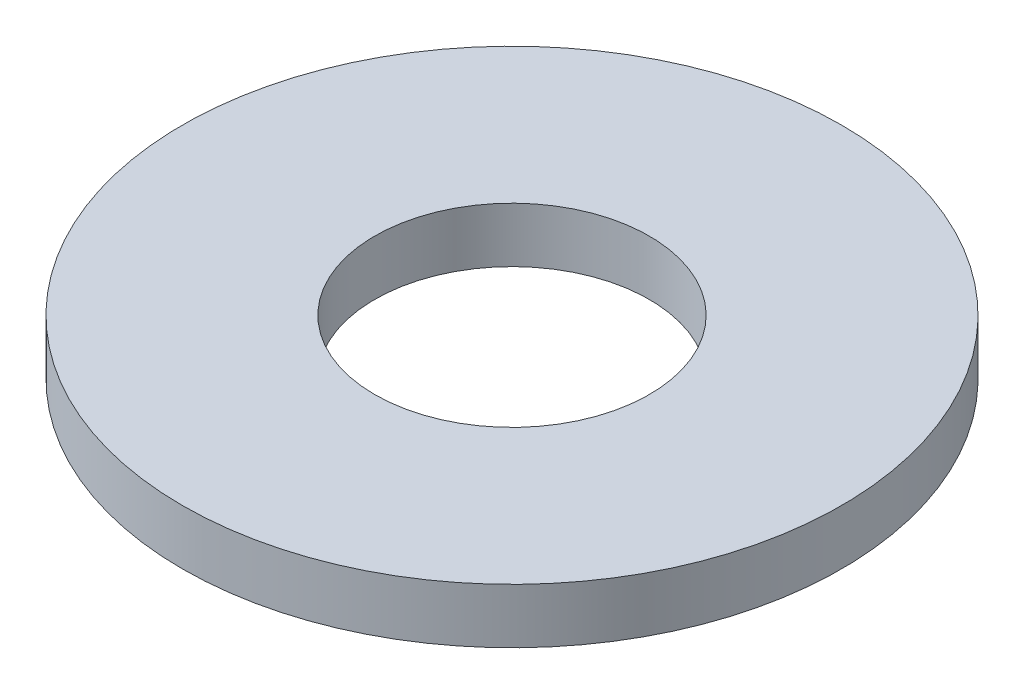
ISO-10303-21;
HEADER;
FILE_DESCRIPTION(('STEP AP214'),'2;1');
FILE_NAME('part.step','',(''),(''),'','','');
FILE_SCHEMA(('AUTOMOTIVE_DESIGN { 1 0 10303 214 1 1 1 1 }'));
ENDSEC;
DATA;
#1=APPLICATION_CONTEXT('core data for automotive mechanical design processes');
#2=APPLICATION_PROTOCOL_DEFINITION('international standard','automotive_design',2000,#1);
#3=PRODUCT_CONTEXT('',#1,'mechanical');
#4=PRODUCT('Part','Part','',(#3));
#5=PRODUCT_RELATED_PRODUCT_CATEGORY('part','',(#4));
#6=PRODUCT_DEFINITION_FORMATION('','',#4);
#7=PRODUCT_DEFINITION_CONTEXT('part definition',#1,'design');
#8=PRODUCT_DEFINITION('design','',#6,#7);
#9=PRODUCT_DEFINITION_SHAPE('','',#8);
#10=(LENGTH_UNIT() NAMED_UNIT(*) SI_UNIT(.MILLI.,.METRE.));
#11=(NAMED_UNIT(*) PLANE_ANGLE_UNIT() SI_UNIT($,.RADIAN.));
#12=(NAMED_UNIT(*) SI_UNIT($,.STERADIAN.) SOLID_ANGLE_UNIT());
#13=UNCERTAINTY_MEASURE_WITH_UNIT(LENGTH_MEASURE(1.E-05),#10,'distance_accuracy_value','');
#14=(GEOMETRIC_REPRESENTATION_CONTEXT(3) GLOBAL_UNCERTAINTY_ASSIGNED_CONTEXT((#13)) GLOBAL_UNIT_ASSIGNED_CONTEXT((#10,
#11,#12)) REPRESENTATION_CONTEXT('',''));
#15=CARTESIAN_POINT('',(0.,0.,0.));
#16=DIRECTION('',(0.,0.,1.));
#17=DIRECTION('',(1.,0.,0.));
#18=AXIS2_PLACEMENT_3D('',#15,#16,#17);
#19=CARTESIAN_POINT('',(0.,1.27,0.));
#20=DIRECTION('',(0.,1.,0.));
#21=DIRECTION('',(0.,0.,1.));
#22=AXIS2_PLACEMENT_3D('',#19,#20,#21);
#23=PLANE('',#22);
#24=CARTESIAN_POINT('',(0.,1.27,0.));
#25=DIRECTION('',(0.,1.,0.));
#26=DIRECTION('',(0.,0.,1.));
#27=AXIS2_PLACEMENT_3D('',#24,#25,#26);
#28=CIRCLE('',#27,7.62);
#29=CARTESIAN_POINT('',(0.,1.27,7.62));
#30=VERTEX_POINT('',#29);
#31=EDGE_CURVE('E10',#30,#30,#28,.T.);
#32=ORIENTED_EDGE('',*,*,#31,.T.);
#33=EDGE_LOOP('',(#32));
#34=FACE_BOUND('',#33,.T.);
#35=CARTESIAN_POINT('',(0.,1.27,0.));
#36=DIRECTION('',(0.,1.,0.));
#37=DIRECTION('',(0.,0.,1.));
#38=AXIS2_PLACEMENT_3D('',#35,#36,#37);
#39=CIRCLE('',#38,3.175);
#40=CARTESIAN_POINT('',(0.,1.27,3.175));
#41=VERTEX_POINT('',#40);
#42=EDGE_CURVE('E42',#41,#41,#39,.T.);
#43=ORIENTED_EDGE('',*,*,#42,.F.);
#44=EDGE_LOOP('',(#43));
#45=FACE_BOUND('',#44,.T.);
#46=ADVANCED_FACE('F31',(#34,#45),#23,.T.);
#47=CARTESIAN_POINT('',(0.,0.,0.));
#48=DIRECTION('',(0.,1.,0.));
#49=DIRECTION('',(0.,0.,1.));
#50=AXIS2_PLACEMENT_3D('',#47,#48,#49);
#51=PLANE('',#50);
#52=CARTESIAN_POINT('',(0.,0.,0.));
#53=DIRECTION('',(0.,1.,0.));
#54=DIRECTION('',(0.,0.,1.));
#55=AXIS2_PLACEMENT_3D('',#52,#53,#54);
#56=CIRCLE('',#55,7.62);
#57=CARTESIAN_POINT('',(0.,0.,7.62));
#58=VERTEX_POINT('',#57);
#59=EDGE_CURVE('E35',#58,#58,#56,.T.);
#60=ORIENTED_EDGE('',*,*,#59,.F.);
#61=EDGE_LOOP('',(#60));
#62=FACE_BOUND('',#61,.T.);
#63=CARTESIAN_POINT('',(0.,0.,0.));
#64=DIRECTION('',(0.,1.,0.));
#65=DIRECTION('',(0.,0.,1.));
#66=AXIS2_PLACEMENT_3D('',#63,#64,#65);
#67=CIRCLE('',#66,3.175);
#68=CARTESIAN_POINT('',(0.,0.,3.175));
#69=VERTEX_POINT('',#68);
#70=EDGE_CURVE('E44',#69,#69,#67,.T.);
#71=ORIENTED_EDGE('',*,*,#70,.T.);
#72=EDGE_LOOP('',(#71));
#73=FACE_BOUND('',#72,.T.);
#74=ADVANCED_FACE('F54',(#62,#73),#51,.F.);
#75=CARTESIAN_POINT('',(0.,1.27,0.));
#76=DIRECTION('',(0.,-1.,0.));
#77=DIRECTION('',(0.,0.,-1.));
#78=AXIS2_PLACEMENT_3D('',#75,#76,#77);
#79=CYLINDRICAL_SURFACE('',#78,7.62);
#80=ORIENTED_EDGE('',*,*,#31,.F.);
#81=EDGE_LOOP('',(#80));
#82=FACE_BOUND('',#81,.T.);
#83=ORIENTED_EDGE('',*,*,#59,.T.);
#84=EDGE_LOOP('',(#83));
#85=FACE_BOUND('',#84,.T.);
#86=ADVANCED_FACE('F33',(#82,#85),#79,.T.);
#87=CARTESIAN_POINT('',(0.,1.27,0.));
#88=DIRECTION('',(0.,-1.,0.));
#89=DIRECTION('',(0.,0.,-1.));
#90=AXIS2_PLACEMENT_3D('',#87,#88,#89);
#91=CYLINDRICAL_SURFACE('',#90,3.175);
#92=ORIENTED_EDGE('',*,*,#42,.T.);
#93=EDGE_LOOP('',(#92));
#94=FACE_BOUND('',#93,.T.);
#95=ORIENTED_EDGE('',*,*,#70,.F.);
#96=EDGE_LOOP('',(#95));
#97=FACE_BOUND('',#96,.T.);
#98=ADVANCED_FACE('F50',(#94,#97),#91,.F.);
#99=CLOSED_SHELL('',(#46,#74,#86,#98));
#100=MANIFOLD_SOLID_BREP('B2',#99);
#101=ADVANCED_BREP_SHAPE_REPRESENTATION('',(#18,#100),#14);
#102=SHAPE_DEFINITION_REPRESENTATION(#9,#101);
ENDSEC;
END-ISO-10303-21;
